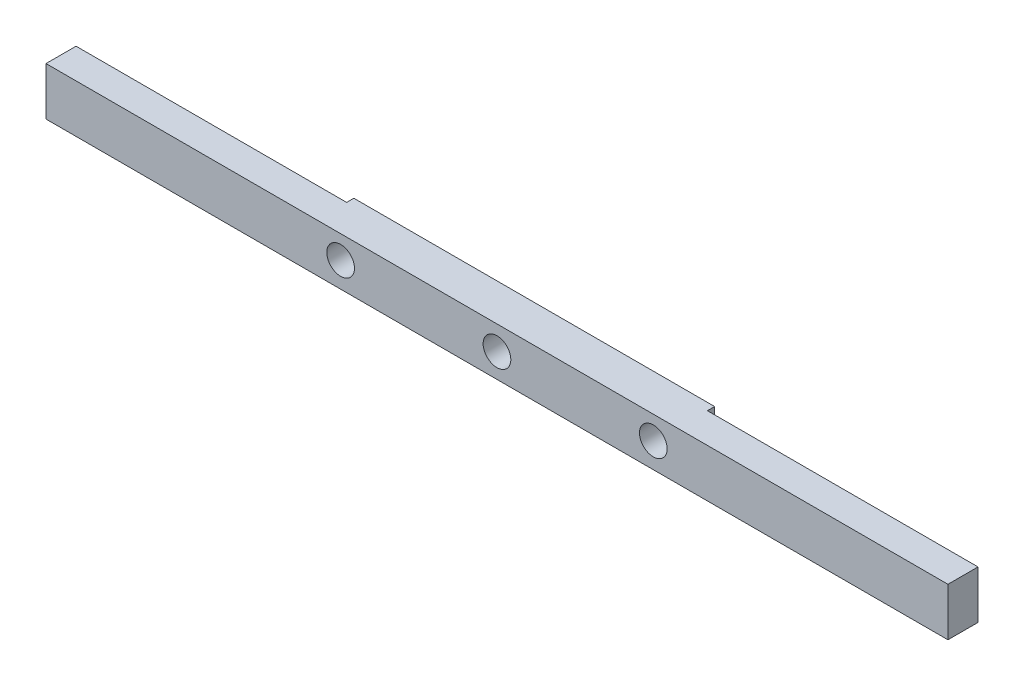
ISO-10303-21;
HEADER;
FILE_DESCRIPTION(('STEP AP214'),'2;1');
FILE_NAME('part.step','',(''),(''),'','','');
FILE_SCHEMA(('AUTOMOTIVE_DESIGN { 1 0 10303 214 1 1 1 1 }'));
ENDSEC;
DATA;
#1=APPLICATION_CONTEXT('core data for automotive mechanical design processes');
#2=APPLICATION_PROTOCOL_DEFINITION('international standard','automotive_design',2000,#1);
#3=PRODUCT_CONTEXT('',#1,'mechanical');
#4=PRODUCT('Part','Part','',(#3));
#5=PRODUCT_RELATED_PRODUCT_CATEGORY('part','',(#4));
#6=PRODUCT_DEFINITION_FORMATION('','',#4);
#7=PRODUCT_DEFINITION_CONTEXT('part definition',#1,'design');
#8=PRODUCT_DEFINITION('design','',#6,#7);
#9=PRODUCT_DEFINITION_SHAPE('','',#8);
#10=(LENGTH_UNIT() NAMED_UNIT(*) SI_UNIT(.MILLI.,.METRE.));
#11=(NAMED_UNIT(*) PLANE_ANGLE_UNIT() SI_UNIT($,.RADIAN.));
#12=(NAMED_UNIT(*) SI_UNIT($,.STERADIAN.) SOLID_ANGLE_UNIT());
#13=UNCERTAINTY_MEASURE_WITH_UNIT(LENGTH_MEASURE(1.E-05),#10,'distance_accuracy_value','');
#14=(GEOMETRIC_REPRESENTATION_CONTEXT(3) GLOBAL_UNCERTAINTY_ASSIGNED_CONTEXT((#13)) GLOBAL_UNIT_ASSIGNED_CONTEXT((#10,
#11,#12)) REPRESENTATION_CONTEXT('',''));
#15=CARTESIAN_POINT('',(0.,0.,0.));
#16=DIRECTION('',(0.,0.,1.));
#17=DIRECTION('',(1.,0.,0.));
#18=AXIS2_PLACEMENT_3D('',#15,#16,#17);
#19=CARTESIAN_POINT('',(0.,0.,0.));
#20=DIRECTION('',(0.,0.,-1.));
#21=DIRECTION('',(-1.,0.,0.));
#22=AXIS2_PLACEMENT_3D('',#19,#20,#21);
#23=PLANE('',#22);
#24=DIRECTION('',(0.,1.,0.));
#25=VECTOR('',#24,1.);
#26=CARTESIAN_POINT('',(22.5,0.,0.));
#27=LINE('',#26,#25);
#28=CARTESIAN_POINT('',(22.5,0.,0.));
#29=VERTEX_POINT('',#28);
#30=CARTESIAN_POINT('',(22.5,4.,0.));
#31=VERTEX_POINT('',#30);
#32=EDGE_CURVE('E48',#29,#31,#27,.T.);
#33=ORIENTED_EDGE('',*,*,#32,.F.);
#34=DIRECTION('',(1.,0.,0.));
#35=VECTOR('',#34,1.);
#36=CARTESIAN_POINT('',(0.,0.,0.));
#37=LINE('',#36,#35);
#38=CARTESIAN_POINT('',(0.,0.,0.));
#39=VERTEX_POINT('',#38);
#40=EDGE_CURVE('E142',#39,#29,#37,.T.);
#41=ORIENTED_EDGE('',*,*,#40,.F.);
#42=DIRECTION('',(0.,-1.,0.));
#43=VECTOR('',#42,1.);
#44=CARTESIAN_POINT('',(0.,0.,0.));
#45=LINE('',#44,#43);
#46=CARTESIAN_POINT('',(0.,4.,0.));
#47=VERTEX_POINT('',#46);
#48=EDGE_CURVE('E122',#47,#39,#45,.T.);
#49=ORIENTED_EDGE('',*,*,#48,.F.);
#50=DIRECTION('',(-1.,0.,0.));
#51=VECTOR('',#50,1.);
#52=CARTESIAN_POINT('',(0.,4.,0.));
#53=LINE('',#52,#51);
#54=EDGE_CURVE('E53',#31,#47,#53,.T.);
#55=ORIENTED_EDGE('',*,*,#54,.F.);
#56=EDGE_LOOP('',(#33,#41,#49,#55));
#57=FACE_BOUND('',#56,.T.);
#58=ADVANCED_FACE('F33',(#57),#23,.T.);
#59=CARTESIAN_POINT('',(0.,0.,2.5));
#60=DIRECTION('',(1.,0.,0.));
#61=DIRECTION('',(0.,0.,-1.));
#62=AXIS2_PLACEMENT_3D('',#59,#60,#61);
#63=PLANE('',#62);
#64=ORIENTED_EDGE('',*,*,#48,.T.);
#65=DIRECTION('',(0.,0.,-1.));
#66=VECTOR('',#65,1.);
#67=CARTESIAN_POINT('',(0.,0.,2.5));
#68=LINE('',#67,#66);
#69=CARTESIAN_POINT('',(0.,0.,2.5));
#70=VERTEX_POINT('',#69);
#71=EDGE_CURVE('E11',#70,#39,#68,.T.);
#72=ORIENTED_EDGE('',*,*,#71,.F.);
#73=DIRECTION('',(0.,-1.,0.));
#74=VECTOR('',#73,1.);
#75=CARTESIAN_POINT('',(0.,0.,2.5));
#76=LINE('',#75,#74);
#77=CARTESIAN_POINT('',(0.,4.,2.5));
#78=VERTEX_POINT('',#77);
#79=EDGE_CURVE('E128',#78,#70,#76,.T.);
#80=ORIENTED_EDGE('',*,*,#79,.F.);
#81=DIRECTION('',(0.,0.,-1.));
#82=VECTOR('',#81,1.);
#83=CARTESIAN_POINT('',(0.,4.,2.5));
#84=LINE('',#83,#82);
#85=EDGE_CURVE('E138',#78,#47,#84,.T.);
#86=ORIENTED_EDGE('',*,*,#85,.T.);
#87=EDGE_LOOP('',(#64,#72,#80,#86));
#88=FACE_BOUND('',#87,.T.);
#89=ADVANCED_FACE('F35',(#88),#63,.F.);
#90=CARTESIAN_POINT('',(0.,0.,2.5));
#91=DIRECTION('',(0.,1.,0.));
#92=DIRECTION('',(0.,0.,1.));
#93=AXIS2_PLACEMENT_3D('',#90,#91,#92);
#94=PLANE('',#93);
#95=ORIENTED_EDGE('',*,*,#40,.T.);
#96=DIRECTION('',(0.,0.,1.));
#97=VECTOR('',#96,1.);
#98=CARTESIAN_POINT('',(22.5,0.,-0.6));
#99=LINE('',#98,#97);
#100=CARTESIAN_POINT('',(22.5,0.,-0.6));
#101=VERTEX_POINT('',#100);
#102=EDGE_CURVE('E169',#101,#29,#99,.T.);
#103=ORIENTED_EDGE('',*,*,#102,.F.);
#104=DIRECTION('',(-1.,0.,0.));
#105=VECTOR('',#104,1.);
#106=CARTESIAN_POINT('',(22.5,0.,-0.6));
#107=LINE('',#106,#105);
#108=CARTESIAN_POINT('',(52.5,0.,-0.6));
#109=VERTEX_POINT('',#108);
#110=EDGE_CURVE('E112',#109,#101,#107,.T.);
#111=ORIENTED_EDGE('',*,*,#110,.F.);
#112=DIRECTION('',(0.,0.,1.));
#113=VECTOR('',#112,1.);
#114=CARTESIAN_POINT('',(52.5,0.,-0.6));
#115=LINE('',#114,#113);
#116=CARTESIAN_POINT('',(52.5,0.,0.));
#117=VERTEX_POINT('',#116);
#118=EDGE_CURVE('E124',#109,#117,#115,.T.);
#119=ORIENTED_EDGE('',*,*,#118,.T.);
#120=CARTESIAN_POINT('',(75.,0.,0.));
#121=VERTEX_POINT('',#120);
#122=EDGE_CURVE('E141',#117,#121,#37,.T.);
#123=ORIENTED_EDGE('',*,*,#122,.T.);
#124=DIRECTION('',(0.,0.,-1.));
#125=VECTOR('',#124,1.);
#126=CARTESIAN_POINT('',(75.,0.,2.5));
#127=LINE('',#126,#125);
#128=CARTESIAN_POINT('',(75.,0.,2.5));
#129=VERTEX_POINT('',#128);
#130=EDGE_CURVE('E41',#129,#121,#127,.T.);
#131=ORIENTED_EDGE('',*,*,#130,.F.);
#132=DIRECTION('',(1.,0.,0.));
#133=VECTOR('',#132,1.);
#134=CARTESIAN_POINT('',(0.,0.,2.5));
#135=LINE('',#134,#133);
#136=EDGE_CURVE('E131',#70,#129,#135,.T.);
#137=ORIENTED_EDGE('',*,*,#136,.F.);
#138=ORIENTED_EDGE('',*,*,#71,.T.);
#139=EDGE_LOOP('',(#95,#103,#111,#119,#123,#131,#137,#138));
#140=FACE_BOUND('',#139,.T.);
#141=ADVANCED_FACE('F175',(#140),#94,.F.);
#142=CARTESIAN_POINT('',(75.,0.,2.5));
#143=DIRECTION('',(-1.,0.,0.));
#144=DIRECTION('',(0.,0.,1.));
#145=AXIS2_PLACEMENT_3D('',#142,#143,#144);
#146=PLANE('',#145);
#147=DIRECTION('',(0.,1.,0.));
#148=VECTOR('',#147,1.);
#149=CARTESIAN_POINT('',(75.,0.,0.));
#150=LINE('',#149,#148);
#151=CARTESIAN_POINT('',(75.,4.,0.));
#152=VERTEX_POINT('',#151);
#153=EDGE_CURVE('E144',#121,#152,#150,.T.);
#154=ORIENTED_EDGE('',*,*,#153,.T.);
#155=DIRECTION('',(0.,0.,-1.));
#156=VECTOR('',#155,1.);
#157=CARTESIAN_POINT('',(75.,4.,2.5));
#158=LINE('',#157,#156);
#159=CARTESIAN_POINT('',(75.,4.,2.5));
#160=VERTEX_POINT('',#159);
#161=EDGE_CURVE('E149',#160,#152,#158,.T.);
#162=ORIENTED_EDGE('',*,*,#161,.F.);
#163=DIRECTION('',(0.,1.,0.));
#164=VECTOR('',#163,1.);
#165=CARTESIAN_POINT('',(75.,0.,2.5));
#166=LINE('',#165,#164);
#167=EDGE_CURVE('E134',#129,#160,#166,.T.);
#168=ORIENTED_EDGE('',*,*,#167,.F.);
#169=ORIENTED_EDGE('',*,*,#130,.T.);
#170=EDGE_LOOP('',(#154,#162,#168,#169));
#171=FACE_BOUND('',#170,.T.);
#172=ADVANCED_FACE('F156',(#171),#146,.F.);
#173=CARTESIAN_POINT('',(0.,4.,2.5));
#174=DIRECTION('',(0.,-1.,0.));
#175=DIRECTION('',(0.,0.,-1.));
#176=AXIS2_PLACEMENT_3D('',#173,#174,#175);
#177=PLANE('',#176);
#178=CARTESIAN_POINT('',(52.5,4.,0.));
#179=VERTEX_POINT('',#178);
#180=EDGE_CURVE('E132',#152,#179,#53,.T.);
#181=ORIENTED_EDGE('',*,*,#180,.T.);
#182=DIRECTION('',(0.,0.,1.));
#183=VECTOR('',#182,1.);
#184=CARTESIAN_POINT('',(52.5,4.,-0.6));
#185=LINE('',#184,#183);
#186=CARTESIAN_POINT('',(52.5,4.,-0.6));
#187=VERTEX_POINT('',#186);
#188=EDGE_CURVE('E103',#187,#179,#185,.T.);
#189=ORIENTED_EDGE('',*,*,#188,.F.);
#190=DIRECTION('',(1.,0.,0.));
#191=VECTOR('',#190,1.);
#192=CARTESIAN_POINT('',(22.5,4.,-0.6));
#193=LINE('',#192,#191);
#194=CARTESIAN_POINT('',(22.5,4.,-0.6));
#195=VERTEX_POINT('',#194);
#196=EDGE_CURVE('E96',#195,#187,#193,.T.);
#197=ORIENTED_EDGE('',*,*,#196,.F.);
#198=DIRECTION('',(0.,0.,1.));
#199=VECTOR('',#198,1.);
#200=CARTESIAN_POINT('',(22.5,4.,-0.6));
#201=LINE('',#200,#199);
#202=EDGE_CURVE('E101',#195,#31,#201,.T.);
#203=ORIENTED_EDGE('',*,*,#202,.T.);
#204=ORIENTED_EDGE('',*,*,#54,.T.);
#205=ORIENTED_EDGE('',*,*,#85,.F.);
#206=DIRECTION('',(-1.,0.,0.));
#207=VECTOR('',#206,1.);
#208=CARTESIAN_POINT('',(0.,4.,2.5));
#209=LINE('',#208,#207);
#210=EDGE_CURVE('E136',#160,#78,#209,.T.);
#211=ORIENTED_EDGE('',*,*,#210,.F.);
#212=ORIENTED_EDGE('',*,*,#161,.T.);
#213=EDGE_LOOP('',(#181,#189,#197,#203,#204,#205,#211,#212));
#214=FACE_BOUND('',#213,.T.);
#215=ADVANCED_FACE('F99',(#214),#177,.F.);
#216=CARTESIAN_POINT('',(0.,0.,2.5));
#217=DIRECTION('',(0.,0.,-1.));
#218=DIRECTION('',(-1.,0.,0.));
#219=AXIS2_PLACEMENT_3D('',#216,#217,#218);
#220=PLANE('',#219);
#221=CARTESIAN_POINT('',(50.5,2.07653163059263,2.5));
#222=DIRECTION('',(0.,0.,1.));
#223=DIRECTION('',(1.,0.,0.));
#224=AXIS2_PLACEMENT_3D('',#221,#222,#223);
#225=CIRCLE('',#224,1.15);
#226=CARTESIAN_POINT('',(51.65,2.07653163059263,2.5));
#227=VERTEX_POINT('',#226);
#228=EDGE_CURVE('E288',#227,#227,#225,.T.);
#229=ORIENTED_EDGE('',*,*,#228,.F.);
#230=EDGE_LOOP('',(#229));
#231=FACE_BOUND('',#230,.T.);
#232=CARTESIAN_POINT('',(24.5,2.07653163059263,2.5));
#233=DIRECTION('',(0.,0.,1.));
#234=DIRECTION('',(1.,0.,0.));
#235=AXIS2_PLACEMENT_3D('',#232,#233,#234);
#236=CIRCLE('',#235,1.15);
#237=CARTESIAN_POINT('',(25.65,2.07653163059263,2.5));
#238=VERTEX_POINT('',#237);
#239=EDGE_CURVE('E290',#238,#238,#236,.T.);
#240=ORIENTED_EDGE('',*,*,#239,.F.);
#241=EDGE_LOOP('',(#240));
#242=FACE_BOUND('',#241,.T.);
#243=CARTESIAN_POINT('',(37.5,2.,2.5));
#244=DIRECTION('',(0.,0.,-1.));
#245=DIRECTION('',(-1.,0.,0.));
#246=AXIS2_PLACEMENT_3D('',#243,#244,#245);
#247=CIRCLE('',#246,1.15);
#248=CARTESIAN_POINT('',(36.35,2.,2.5));
#249=VERTEX_POINT('',#248);
#250=EDGE_CURVE('E119',#249,#249,#247,.T.);
#251=ORIENTED_EDGE('',*,*,#250,.T.);
#252=EDGE_LOOP('',(#251));
#253=FACE_BOUND('',#252,.T.);
#254=ORIENTED_EDGE('',*,*,#79,.T.);
#255=ORIENTED_EDGE('',*,*,#136,.T.);
#256=ORIENTED_EDGE('',*,*,#167,.T.);
#257=ORIENTED_EDGE('',*,*,#210,.T.);
#258=EDGE_LOOP('',(#254,#255,#256,#257));
#259=FACE_BOUND('',#258,.T.);
#260=ADVANCED_FACE('F181',(#231,#242,#253,#259),#220,.F.);
#261=DIRECTION('',(0.,-1.,0.));
#262=VECTOR('',#261,1.);
#263=CARTESIAN_POINT('',(52.5,0.,0.));
#264=LINE('',#263,#262);
#265=EDGE_CURVE('E116',#179,#117,#264,.T.);
#266=ORIENTED_EDGE('',*,*,#265,.F.);
#267=ORIENTED_EDGE('',*,*,#180,.F.);
#268=ORIENTED_EDGE('',*,*,#153,.F.);
#269=ORIENTED_EDGE('',*,*,#122,.F.);
#270=EDGE_LOOP('',(#266,#267,#268,#269));
#271=FACE_BOUND('',#270,.T.);
#272=ADVANCED_FACE('F161',(#271),#23,.T.);
#273=CARTESIAN_POINT('',(37.5,2.,3.));
#274=DIRECTION('',(0.,0.,-1.));
#275=DIRECTION('',(-1.,0.,0.));
#276=AXIS2_PLACEMENT_3D('',#273,#274,#275);
#277=CYLINDRICAL_SURFACE('',#276,1.15);
#278=ORIENTED_EDGE('',*,*,#250,.F.);
#279=EDGE_LOOP('',(#278));
#280=FACE_BOUND('',#279,.T.);
#281=CARTESIAN_POINT('',(37.5,2.,-0.6));
#282=DIRECTION('',(0.,0.,-1.));
#283=DIRECTION('',(-1.,0.,0.));
#284=AXIS2_PLACEMENT_3D('',#281,#282,#283);
#285=CIRCLE('',#284,1.15);
#286=CARTESIAN_POINT('',(36.35,2.,-0.6));
#287=VERTEX_POINT('',#286);
#288=EDGE_CURVE('E173',#287,#287,#285,.T.);
#289=ORIENTED_EDGE('',*,*,#288,.T.);
#290=EDGE_LOOP('',(#289));
#291=FACE_BOUND('',#290,.T.);
#292=ADVANCED_FACE('F189',(#280,#291),#277,.F.);
#293=CARTESIAN_POINT('',(0.,0.,-0.6));
#294=DIRECTION('',(0.,0.,-1.));
#295=DIRECTION('',(-1.,0.,0.));
#296=AXIS2_PLACEMENT_3D('',#293,#294,#295);
#297=PLANE('',#296);
#298=CARTESIAN_POINT('',(50.5,2.07653163059263,-0.6));
#299=DIRECTION('',(0.,0.,1.));
#300=DIRECTION('',(1.,0.,0.));
#301=AXIS2_PLACEMENT_3D('',#298,#299,#300);
#302=CIRCLE('',#301,1.15);
#303=CARTESIAN_POINT('',(51.65,2.07653163059263,-0.6));
#304=VERTEX_POINT('',#303);
#305=EDGE_CURVE('E286',#304,#304,#302,.T.);
#306=ORIENTED_EDGE('',*,*,#305,.T.);
#307=EDGE_LOOP('',(#306));
#308=FACE_BOUND('',#307,.T.);
#309=CARTESIAN_POINT('',(24.5,2.07653163059263,-0.6));
#310=DIRECTION('',(0.,0.,1.));
#311=DIRECTION('',(1.,0.,0.));
#312=AXIS2_PLACEMENT_3D('',#309,#310,#311);
#313=CIRCLE('',#312,1.15);
#314=CARTESIAN_POINT('',(25.65,2.07653163059263,-0.6));
#315=VERTEX_POINT('',#314);
#316=EDGE_CURVE('E293',#315,#315,#313,.T.);
#317=ORIENTED_EDGE('',*,*,#316,.T.);
#318=EDGE_LOOP('',(#317));
#319=FACE_BOUND('',#318,.T.);
#320=ORIENTED_EDGE('',*,*,#288,.F.);
#321=EDGE_LOOP('',(#320));
#322=FACE_BOUND('',#321,.T.);
#323=DIRECTION('',(0.,1.,0.));
#324=VECTOR('',#323,1.);
#325=CARTESIAN_POINT('',(22.5,0.,-0.6));
#326=LINE('',#325,#324);
#327=EDGE_CURVE('E107',#101,#195,#326,.T.);
#328=ORIENTED_EDGE('',*,*,#327,.T.);
#329=ORIENTED_EDGE('',*,*,#196,.T.);
#330=DIRECTION('',(0.,-1.,0.));
#331=VECTOR('',#330,1.);
#332=CARTESIAN_POINT('',(52.5,0.,-0.6));
#333=LINE('',#332,#331);
#334=EDGE_CURVE('E106',#187,#109,#333,.T.);
#335=ORIENTED_EDGE('',*,*,#334,.T.);
#336=ORIENTED_EDGE('',*,*,#110,.T.);
#337=EDGE_LOOP('',(#328,#329,#335,#336));
#338=FACE_BOUND('',#337,.T.);
#339=ADVANCED_FACE('F110',(#308,#319,#322,#338),#297,.T.);
#340=CARTESIAN_POINT('',(52.5,0.,-0.6));
#341=DIRECTION('',(-1.,0.,0.));
#342=DIRECTION('',(0.,0.,1.));
#343=AXIS2_PLACEMENT_3D('',#340,#341,#342);
#344=PLANE('',#343);
#345=ORIENTED_EDGE('',*,*,#265,.T.);
#346=ORIENTED_EDGE('',*,*,#118,.F.);
#347=ORIENTED_EDGE('',*,*,#334,.F.);
#348=ORIENTED_EDGE('',*,*,#188,.T.);
#349=EDGE_LOOP('',(#345,#346,#347,#348));
#350=FACE_BOUND('',#349,.T.);
#351=ADVANCED_FACE('F165',(#350),#344,.F.);
#352=CARTESIAN_POINT('',(22.5,0.,-0.6));
#353=DIRECTION('',(1.,0.,0.));
#354=DIRECTION('',(0.,0.,-1.));
#355=AXIS2_PLACEMENT_3D('',#352,#353,#354);
#356=PLANE('',#355);
#357=ORIENTED_EDGE('',*,*,#32,.T.);
#358=ORIENTED_EDGE('',*,*,#202,.F.);
#359=ORIENTED_EDGE('',*,*,#327,.F.);
#360=ORIENTED_EDGE('',*,*,#102,.T.);
#361=EDGE_LOOP('',(#357,#358,#359,#360));
#362=FACE_BOUND('',#361,.T.);
#363=ADVANCED_FACE('F118',(#362),#356,.F.);
#364=CARTESIAN_POINT('',(24.5,2.07653163059263,-0.6));
#365=DIRECTION('',(0.,0.,1.));
#366=DIRECTION('',(1.,0.,0.));
#367=AXIS2_PLACEMENT_3D('',#364,#365,#366);
#368=CYLINDRICAL_SURFACE('',#367,1.15);
#369=CARTESIAN_POINT('',(25.65,2.07653163059263,-0.6));
#370=CARTESIAN_POINT('',(25.65,2.07653163059263,-0.567708333333333));
#371=CARTESIAN_POINT('',(25.65,2.07653163059263,-0.535416666666667));
#372=CARTESIAN_POINT('',(25.65,2.07653163059263,-0.470833333333333));
#373=CARTESIAN_POINT('',(25.65,2.07653163059263,-0.438541666666667));
#374=CARTESIAN_POINT('',(25.65,2.07653163059263,-0.373958333333333));
#375=CARTESIAN_POINT('',(25.65,2.07653163059263,-0.341666666666667));
#376=CARTESIAN_POINT('',(25.65,2.07653163059263,-0.277083333333333));
#377=CARTESIAN_POINT('',(25.65,2.07653163059263,-0.244791666666667));
#378=CARTESIAN_POINT('',(25.65,2.07653163059263,-0.180208333333333));
#379=CARTESIAN_POINT('',(25.65,2.07653163059263,-0.147916666666667));
#380=CARTESIAN_POINT('',(25.65,2.07653163059263,-0.0833333333333333));
#381=CARTESIAN_POINT('',(25.65,2.07653163059263,-0.0510416666666666));
#382=CARTESIAN_POINT('',(25.65,2.07653163059263,0.0135416666666667));
#383=CARTESIAN_POINT('',(25.65,2.07653163059263,0.0458333333333334));
#384=CARTESIAN_POINT('',(25.65,2.07653163059263,0.110416666666667));
#385=CARTESIAN_POINT('',(25.65,2.07653163059263,0.142708333333333));
#386=CARTESIAN_POINT('',(25.65,2.07653163059263,0.207291666666667));
#387=CARTESIAN_POINT('',(25.65,2.07653163059263,0.239583333333333));
#388=CARTESIAN_POINT('',(25.65,2.07653163059263,0.304166666666667));
#389=CARTESIAN_POINT('',(25.65,2.07653163059263,0.336458333333333));
#390=CARTESIAN_POINT('',(25.65,2.07653163059263,0.401041666666667));
#391=CARTESIAN_POINT('',(25.65,2.07653163059263,0.433333333333333));
#392=CARTESIAN_POINT('',(25.65,2.07653163059263,0.497916666666667));
#393=CARTESIAN_POINT('',(25.65,2.07653163059263,0.530208333333333));
#394=CARTESIAN_POINT('',(25.65,2.07653163059263,0.594791666666667));
#395=CARTESIAN_POINT('',(25.65,2.07653163059263,0.627083333333333));
#396=CARTESIAN_POINT('',(25.65,2.07653163059263,0.691666666666667));
#397=CARTESIAN_POINT('',(25.65,2.07653163059263,0.723958333333333));
#398=CARTESIAN_POINT('',(25.65,2.07653163059263,0.788541666666667));
#399=CARTESIAN_POINT('',(25.65,2.07653163059263,0.820833333333333));
#400=CARTESIAN_POINT('',(25.65,2.07653163059263,0.885416666666667));
#401=CARTESIAN_POINT('',(25.65,2.07653163059263,0.917708333333333));
#402=CARTESIAN_POINT('',(25.65,2.07653163059263,0.982291666666667));
#403=CARTESIAN_POINT('',(25.65,2.07653163059263,1.01458333333333));
#404=CARTESIAN_POINT('',(25.65,2.07653163059263,1.07916666666667));
#405=CARTESIAN_POINT('',(25.65,2.07653163059263,1.11145833333333));
#406=CARTESIAN_POINT('',(25.65,2.07653163059263,1.17604166666667));
#407=CARTESIAN_POINT('',(25.65,2.07653163059263,1.20833333333333));
#408=CARTESIAN_POINT('',(25.65,2.07653163059263,1.27291666666667));
#409=CARTESIAN_POINT('',(25.65,2.07653163059263,1.30520833333333));
#410=CARTESIAN_POINT('',(25.65,2.07653163059263,1.36979166666667));
#411=CARTESIAN_POINT('',(25.65,2.07653163059263,1.40208333333333));
#412=CARTESIAN_POINT('',(25.65,2.07653163059263,1.46666666666667));
#413=CARTESIAN_POINT('',(25.65,2.07653163059263,1.49895833333333));
#414=CARTESIAN_POINT('',(25.65,2.07653163059263,1.56354166666667));
#415=CARTESIAN_POINT('',(25.65,2.07653163059263,1.59583333333333));
#416=CARTESIAN_POINT('',(25.65,2.07653163059263,1.66041666666667));
#417=CARTESIAN_POINT('',(25.65,2.07653163059263,1.69270833333333));
#418=CARTESIAN_POINT('',(25.65,2.07653163059263,1.75729166666667));
#419=CARTESIAN_POINT('',(25.65,2.07653163059263,1.78958333333333));
#420=CARTESIAN_POINT('',(25.65,2.07653163059263,1.85416666666667));
#421=CARTESIAN_POINT('',(25.65,2.07653163059263,1.88645833333333));
#422=CARTESIAN_POINT('',(25.65,2.07653163059263,1.95104166666667));
#423=CARTESIAN_POINT('',(25.65,2.07653163059263,1.98333333333333));
#424=CARTESIAN_POINT('',(25.65,2.07653163059263,2.04791666666667));
#425=CARTESIAN_POINT('',(25.65,2.07653163059263,2.08020833333333));
#426=CARTESIAN_POINT('',(25.65,2.07653163059263,2.14479166666667));
#427=CARTESIAN_POINT('',(25.65,2.07653163059263,2.17708333333333));
#428=CARTESIAN_POINT('',(25.65,2.07653163059263,2.24166666666667));
#429=CARTESIAN_POINT('',(25.65,2.07653163059263,2.27395833333333));
#430=CARTESIAN_POINT('',(25.65,2.07653163059263,2.33854166666667));
#431=CARTESIAN_POINT('',(25.65,2.07653163059263,2.37083333333333));
#432=CARTESIAN_POINT('',(25.65,2.07653163059263,2.43541666666667));
#433=CARTESIAN_POINT('',(25.65,2.07653163059263,2.46770833333333));
#434=CARTESIAN_POINT('',(25.65,2.07653163059263,2.5));
#435=B_SPLINE_CURVE_WITH_KNOTS('',3,(#369,#370,#371,#372,#373,#374,#375,#376,#377,#378,#379,
#380,#381,#382,#383,#384,#385,#386,#387,#388,#389,#390,#391,#392,#393,#394,#395,#396,#397,#398,
#399,#400,#401,#402,#403,#404,#405,#406,#407,#408,#409,#410,#411,#412,#413,#414,#415,#416,#417,
#418,#419,#420,#421,#422,#423,#424,#425,#426,#427,#428,#429,#430,#431,#432,#433,#434),
.UNSPECIFIED.,.F.,.F.,(4,2,2,2,2,2,2,2,2,2,2,2,2,2,2,2,2,2,2,2,2,2,2,2,2,2,2,2,2,2,2,2,4),(0.,
0.0968750000000001,0.19375,0.290625,0.3875,0.484375,0.58125,0.678125,0.775,0.871875,0.96875,
1.065625,1.1625,1.259375,1.35625,1.453125,1.55,1.646875,1.74375,1.840625,1.9375,2.034375,
2.13125,2.228125,2.325,2.421875,2.51875,2.615625,2.7125,2.809375,2.90625,3.003125,3.1),.UNSPECIFIED.);
#436=EDGE_CURVE('BSEAM243',#315,#238,#435,.T.);
#437=ORIENTED_EDGE('',*,*,#316,.F.);
#438=ORIENTED_EDGE('',*,*,#239,.T.);
#439=ORIENTED_EDGE('',*,*,#436,.T.);
#440=ORIENTED_EDGE('',*,*,#436,.F.);
#441=EDGE_LOOP('',(#437,#439,#438,#440));
#442=FACE_BOUND('',#441,.T.);
#443=ADVANCED_FACE('F243',(#442),#368,.F.);
#444=CARTESIAN_POINT('',(50.5,2.07653163059263,-0.6));
#445=DIRECTION('',(0.,0.,1.));
#446=DIRECTION('',(1.,0.,0.));
#447=AXIS2_PLACEMENT_3D('',#444,#445,#446);
#448=CYLINDRICAL_SURFACE('',#447,1.15);
#449=CARTESIAN_POINT('',(51.65,2.07653163059263,-0.6));
#450=CARTESIAN_POINT('',(51.65,2.07653163059263,-0.567708333333333));
#451=CARTESIAN_POINT('',(51.65,2.07653163059263,-0.535416666666667));
#452=CARTESIAN_POINT('',(51.65,2.07653163059263,-0.470833333333333));
#453=CARTESIAN_POINT('',(51.65,2.07653163059263,-0.438541666666667));
#454=CARTESIAN_POINT('',(51.65,2.07653163059263,-0.373958333333333));
#455=CARTESIAN_POINT('',(51.65,2.07653163059263,-0.341666666666667));
#456=CARTESIAN_POINT('',(51.65,2.07653163059263,-0.277083333333333));
#457=CARTESIAN_POINT('',(51.65,2.07653163059263,-0.244791666666667));
#458=CARTESIAN_POINT('',(51.65,2.07653163059263,-0.180208333333333));
#459=CARTESIAN_POINT('',(51.65,2.07653163059263,-0.147916666666667));
#460=CARTESIAN_POINT('',(51.65,2.07653163059263,-0.0833333333333333));
#461=CARTESIAN_POINT('',(51.65,2.07653163059263,-0.0510416666666666));
#462=CARTESIAN_POINT('',(51.65,2.07653163059263,0.0135416666666667));
#463=CARTESIAN_POINT('',(51.65,2.07653163059263,0.0458333333333334));
#464=CARTESIAN_POINT('',(51.65,2.07653163059263,0.110416666666667));
#465=CARTESIAN_POINT('',(51.65,2.07653163059263,0.142708333333333));
#466=CARTESIAN_POINT('',(51.65,2.07653163059263,0.207291666666667));
#467=CARTESIAN_POINT('',(51.65,2.07653163059263,0.239583333333333));
#468=CARTESIAN_POINT('',(51.65,2.07653163059263,0.304166666666667));
#469=CARTESIAN_POINT('',(51.65,2.07653163059263,0.336458333333333));
#470=CARTESIAN_POINT('',(51.65,2.07653163059263,0.401041666666667));
#471=CARTESIAN_POINT('',(51.65,2.07653163059263,0.433333333333333));
#472=CARTESIAN_POINT('',(51.65,2.07653163059263,0.497916666666667));
#473=CARTESIAN_POINT('',(51.65,2.07653163059263,0.530208333333333));
#474=CARTESIAN_POINT('',(51.65,2.07653163059263,0.594791666666667));
#475=CARTESIAN_POINT('',(51.65,2.07653163059263,0.627083333333333));
#476=CARTESIAN_POINT('',(51.65,2.07653163059263,0.691666666666667));
#477=CARTESIAN_POINT('',(51.65,2.07653163059263,0.723958333333333));
#478=CARTESIAN_POINT('',(51.65,2.07653163059263,0.788541666666667));
#479=CARTESIAN_POINT('',(51.65,2.07653163059263,0.820833333333333));
#480=CARTESIAN_POINT('',(51.65,2.07653163059263,0.885416666666667));
#481=CARTESIAN_POINT('',(51.65,2.07653163059263,0.917708333333333));
#482=CARTESIAN_POINT('',(51.65,2.07653163059263,0.982291666666667));
#483=CARTESIAN_POINT('',(51.65,2.07653163059263,1.01458333333333));
#484=CARTESIAN_POINT('',(51.65,2.07653163059263,1.07916666666667));
#485=CARTESIAN_POINT('',(51.65,2.07653163059263,1.11145833333333));
#486=CARTESIAN_POINT('',(51.65,2.07653163059263,1.17604166666667));
#487=CARTESIAN_POINT('',(51.65,2.07653163059263,1.20833333333333));
#488=CARTESIAN_POINT('',(51.65,2.07653163059263,1.27291666666667));
#489=CARTESIAN_POINT('',(51.65,2.07653163059263,1.30520833333333));
#490=CARTESIAN_POINT('',(51.65,2.07653163059263,1.36979166666667));
#491=CARTESIAN_POINT('',(51.65,2.07653163059263,1.40208333333333));
#492=CARTESIAN_POINT('',(51.65,2.07653163059263,1.46666666666667));
#493=CARTESIAN_POINT('',(51.65,2.07653163059263,1.49895833333333));
#494=CARTESIAN_POINT('',(51.65,2.07653163059263,1.56354166666667));
#495=CARTESIAN_POINT('',(51.65,2.07653163059263,1.59583333333333));
#496=CARTESIAN_POINT('',(51.65,2.07653163059263,1.66041666666667));
#497=CARTESIAN_POINT('',(51.65,2.07653163059263,1.69270833333333));
#498=CARTESIAN_POINT('',(51.65,2.07653163059263,1.75729166666667));
#499=CARTESIAN_POINT('',(51.65,2.07653163059263,1.78958333333333));
#500=CARTESIAN_POINT('',(51.65,2.07653163059263,1.85416666666667));
#501=CARTESIAN_POINT('',(51.65,2.07653163059263,1.88645833333333));
#502=CARTESIAN_POINT('',(51.65,2.07653163059263,1.95104166666667));
#503=CARTESIAN_POINT('',(51.65,2.07653163059263,1.98333333333333));
#504=CARTESIAN_POINT('',(51.65,2.07653163059263,2.04791666666667));
#505=CARTESIAN_POINT('',(51.65,2.07653163059263,2.08020833333333));
#506=CARTESIAN_POINT('',(51.65,2.07653163059263,2.14479166666667));
#507=CARTESIAN_POINT('',(51.65,2.07653163059263,2.17708333333333));
#508=CARTESIAN_POINT('',(51.65,2.07653163059263,2.24166666666667));
#509=CARTESIAN_POINT('',(51.65,2.07653163059263,2.27395833333333));
#510=CARTESIAN_POINT('',(51.65,2.07653163059263,2.33854166666667));
#511=CARTESIAN_POINT('',(51.65,2.07653163059263,2.37083333333333));
#512=CARTESIAN_POINT('',(51.65,2.07653163059263,2.43541666666667));
#513=CARTESIAN_POINT('',(51.65,2.07653163059263,2.46770833333333));
#514=CARTESIAN_POINT('',(51.65,2.07653163059263,2.5));
#515=B_SPLINE_CURVE_WITH_KNOTS('',3,(#449,#450,#451,#452,#453,#454,#455,#456,#457,#458,#459,
#460,#461,#462,#463,#464,#465,#466,#467,#468,#469,#470,#471,#472,#473,#474,#475,#476,#477,#478,
#479,#480,#481,#482,#483,#484,#485,#486,#487,#488,#489,#490,#491,#492,#493,#494,#495,#496,#497,
#498,#499,#500,#501,#502,#503,#504,#505,#506,#507,#508,#509,#510,#511,#512,#513,#514),
.UNSPECIFIED.,.F.,.F.,(4,2,2,2,2,2,2,2,2,2,2,2,2,2,2,2,2,2,2,2,2,2,2,2,2,2,2,2,2,2,2,2,4),(0.,
0.0968750000000001,0.19375,0.290625,0.3875,0.484375,0.58125,0.678125,0.775,0.871875,0.96875,
1.065625,1.1625,1.259375,1.35625,1.453125,1.55,1.646875,1.74375,1.840625,1.9375,2.034375,
2.13125,2.228125,2.325,2.421875,2.51875,2.615625,2.7125,2.809375,2.90625,3.003125,3.1),.UNSPECIFIED.);
#516=EDGE_CURVE('BSEAM269',#304,#227,#515,.T.);
#517=ORIENTED_EDGE('',*,*,#305,.F.);
#518=ORIENTED_EDGE('',*,*,#228,.T.);
#519=ORIENTED_EDGE('',*,*,#516,.T.);
#520=ORIENTED_EDGE('',*,*,#516,.F.);
#521=EDGE_LOOP('',(#517,#519,#518,#520));
#522=FACE_BOUND('',#521,.T.);
#523=ADVANCED_FACE('F269',(#522),#448,.F.);
#524=CLOSED_SHELL('',(#58,#89,#141,#172,#215,#260,#272,#292,#339,#351,#363,#443,#523));
#525=MANIFOLD_SOLID_BREP('B2',#524);
#526=ADVANCED_BREP_SHAPE_REPRESENTATION('',(#18,#525),#14);
#527=SHAPE_DEFINITION_REPRESENTATION(#9,#526);
ENDSEC;
END-ISO-10303-21;
